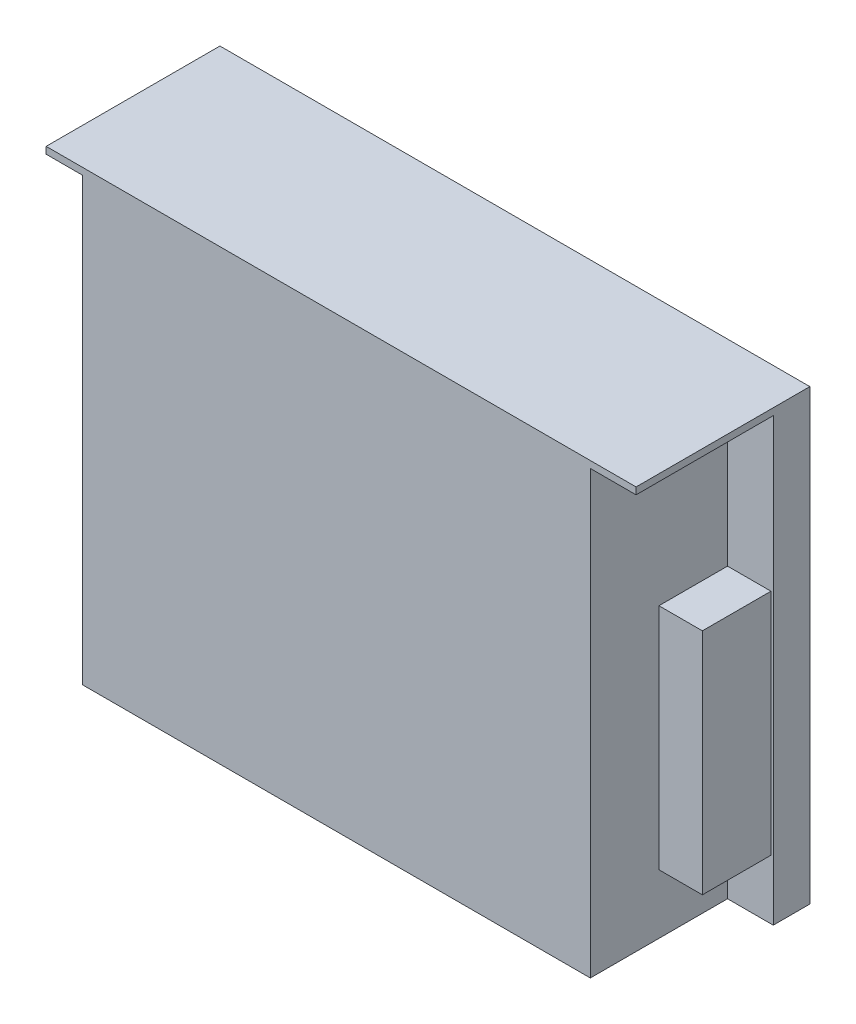
ISO-10303-21;
HEADER;
FILE_DESCRIPTION(('STEP AP214'),'2;1');
FILE_NAME('part.step','',(''),(''),'','','');
FILE_SCHEMA(('AUTOMOTIVE_DESIGN { 1 0 10303 214 1 1 1 1 }'));
ENDSEC;
DATA;
#1=APPLICATION_CONTEXT('core data for automotive mechanical design processes');
#2=APPLICATION_PROTOCOL_DEFINITION('international standard','automotive_design',2000,#1);
#3=PRODUCT_CONTEXT('',#1,'mechanical');
#4=PRODUCT('Part','Part','',(#3));
#5=PRODUCT_RELATED_PRODUCT_CATEGORY('part','',(#4));
#6=PRODUCT_DEFINITION_FORMATION('','',#4);
#7=PRODUCT_DEFINITION_CONTEXT('part definition',#1,'design');
#8=PRODUCT_DEFINITION('design','',#6,#7);
#9=PRODUCT_DEFINITION_SHAPE('','',#8);
#10=(LENGTH_UNIT() NAMED_UNIT(*) SI_UNIT(.MILLI.,.METRE.));
#11=(NAMED_UNIT(*) PLANE_ANGLE_UNIT() SI_UNIT($,.RADIAN.));
#12=(NAMED_UNIT(*) SI_UNIT($,.STERADIAN.) SOLID_ANGLE_UNIT());
#13=UNCERTAINTY_MEASURE_WITH_UNIT(LENGTH_MEASURE(1.E-05),#10,'distance_accuracy_value','');
#14=(GEOMETRIC_REPRESENTATION_CONTEXT(3) GLOBAL_UNCERTAINTY_ASSIGNED_CONTEXT((#13)) GLOBAL_UNIT_ASSIGNED_CONTEXT((#10,
#11,#12)) REPRESENTATION_CONTEXT('',''));
#15=CARTESIAN_POINT('',(0.,0.,0.));
#16=DIRECTION('',(0.,0.,1.));
#17=DIRECTION('',(1.,0.,0.));
#18=AXIS2_PLACEMENT_3D('',#15,#16,#17);
#19=CARTESIAN_POINT('',(8.,0.,17.));
#20=DIRECTION('',(0.707106781186551,0.,-0.707106781186544));
#21=DIRECTION('',(0.,-1.,0.));
#22=AXIS2_PLACEMENT_3D('',#19,#20,#21);
#23=PLANE('',#22);
#24=DIRECTION('',(-0.707106781186546,0.,-0.707106781186549));
#25=VECTOR('',#24,1.);
#26=CARTESIAN_POINT('',(0.,10.,9.));
#27=LINE('',#26,#25);
#28=CARTESIAN_POINT('',(8.,10.,17.));
#29=VERTEX_POINT('',#28);
#30=CARTESIAN_POINT('',(0.,10.,9.));
#31=VERTEX_POINT('',#30);
#32=EDGE_CURVE('E159',#29,#31,#27,.T.);
#33=ORIENTED_EDGE('',*,*,#32,.F.);
#34=DIRECTION('',(0.,-1.,0.));
#35=VECTOR('',#34,1.);
#36=CARTESIAN_POINT('',(8.,0.,17.));
#37=LINE('',#36,#35);
#38=CARTESIAN_POINT('',(8.,96.5,17.));
#39=VERTEX_POINT('',#38);
#40=EDGE_CURVE('E44',#39,#29,#37,.T.);
#41=ORIENTED_EDGE('',*,*,#40,.F.);
#42=DIRECTION('',(0.707106781186544,0.,0.707106781186551));
#43=VECTOR('',#42,1.);
#44=CARTESIAN_POINT('',(8.,96.5,17.));
#45=LINE('',#44,#43);
#46=CARTESIAN_POINT('',(0.,96.5,9.));
#47=VERTEX_POINT('',#46);
#48=EDGE_CURVE('E11',#47,#39,#45,.T.);
#49=ORIENTED_EDGE('',*,*,#48,.F.);
#50=DIRECTION('',(0.,-1.,0.));
#51=VECTOR('',#50,1.);
#52=CARTESIAN_POINT('',(0.,0.,9.));
#53=LINE('',#52,#51);
#54=EDGE_CURVE('E179',#47,#31,#53,.T.);
#55=ORIENTED_EDGE('',*,*,#54,.T.);
#56=EDGE_LOOP('',(#33,#41,#49,#55));
#57=FACE_BOUND('',#56,.T.);
#58=ADVANCED_FACE('F37',(#57),#23,.F.);
#59=CARTESIAN_POINT('',(119.,0.,8.));
#60=DIRECTION('',(-1.,0.,0.));
#61=DIRECTION('',(0.,0.,1.));
#62=AXIS2_PLACEMENT_3D('',#59,#60,#61);
#63=PLANE('',#62);
#64=DIRECTION('',(0.,0.,-1.));
#65=VECTOR('',#64,1.);
#66=CARTESIAN_POINT('',(119.,63.,23.));
#67=LINE('',#66,#65);
#68=CARTESIAN_POINT('',(119.,63.,23.));
#69=VERTEX_POINT('',#68);
#70=CARTESIAN_POINT('',(119.,63.,8.));
#71=VERTEX_POINT('',#70);
#72=EDGE_CURVE('E208',#69,#71,#67,.T.);
#73=ORIENTED_EDGE('',*,*,#72,.T.);
#74=DIRECTION('',(0.,-1.,0.));
#75=VECTOR('',#74,1.);
#76=CARTESIAN_POINT('',(119.,0.,8.));
#77=LINE('',#76,#75);
#78=CARTESIAN_POINT('',(119.,96.5,8.));
#79=VERTEX_POINT('',#78);
#80=EDGE_CURVE('E222',#79,#71,#77,.T.);
#81=ORIENTED_EDGE('',*,*,#80,.F.);
#82=DIRECTION('',(0.,0.,1.));
#83=VECTOR('',#82,1.);
#84=CARTESIAN_POINT('',(119.,96.5,8.));
#85=LINE('',#84,#83);
#86=CARTESIAN_POINT('',(119.,96.5,38.));
#87=VERTEX_POINT('',#86);
#88=EDGE_CURVE('E236',#79,#87,#85,.T.);
#89=ORIENTED_EDGE('',*,*,#88,.T.);
#90=DIRECTION('',(0.,-1.,0.));
#91=VECTOR('',#90,1.);
#92=CARTESIAN_POINT('',(119.,0.,38.));
#93=LINE('',#92,#91);
#94=CARTESIAN_POINT('',(119.,0.,38.));
#95=VERTEX_POINT('',#94);
#96=EDGE_CURVE('E218',#87,#95,#93,.T.);
#97=ORIENTED_EDGE('',*,*,#96,.T.);
#98=DIRECTION('',(0.,0.,1.));
#99=VECTOR('',#98,1.);
#100=CARTESIAN_POINT('',(119.,0.,8.));
#101=LINE('',#100,#99);
#102=CARTESIAN_POINT('',(119.,0.,8.));
#103=VERTEX_POINT('',#102);
#104=EDGE_CURVE('E232',#103,#95,#101,.T.);
#105=ORIENTED_EDGE('',*,*,#104,.F.);
#106=CARTESIAN_POINT('',(119.,13.,8.));
#107=VERTEX_POINT('',#106);
#108=EDGE_CURVE('E221',#107,#103,#77,.T.);
#109=ORIENTED_EDGE('',*,*,#108,.F.);
#110=DIRECTION('',(0.,0.,-1.));
#111=VECTOR('',#110,1.);
#112=CARTESIAN_POINT('',(119.,13.,23.));
#113=LINE('',#112,#111);
#114=CARTESIAN_POINT('',(119.,13.,23.));
#115=VERTEX_POINT('',#114);
#116=EDGE_CURVE('E206',#115,#107,#113,.T.);
#117=ORIENTED_EDGE('',*,*,#116,.F.);
#118=DIRECTION('',(0.,-1.,0.));
#119=VECTOR('',#118,1.);
#120=CARTESIAN_POINT('',(119.,13.,23.));
#121=LINE('',#120,#119);
#122=EDGE_CURVE('E194',#69,#115,#121,.T.);
#123=ORIENTED_EDGE('',*,*,#122,.F.);
#124=EDGE_LOOP('',(#73,#81,#89,#97,#105,#109,#117,#123));
#125=FACE_BOUND('',#124,.T.);
#126=ADVANCED_FACE('F297',(#125),#63,.F.);
#127=CARTESIAN_POINT('',(0.,0.,8.));
#128=DIRECTION('',(0.,0.,1.));
#129=DIRECTION('',(1.,0.,0.));
#130=AXIS2_PLACEMENT_3D('',#127,#128,#129);
#131=PLANE('',#130);
#132=ORIENTED_EDGE('',*,*,#80,.T.);
#133=DIRECTION('',(-1.,0.,0.));
#134=VECTOR('',#133,1.);
#135=CARTESIAN_POINT('',(128.5,63.,8.));
#136=LINE('',#135,#134);
#137=CARTESIAN_POINT('',(128.5,63.,8.));
#138=VERTEX_POINT('',#137);
#139=EDGE_CURVE('E201',#138,#71,#136,.T.);
#140=ORIENTED_EDGE('',*,*,#139,.F.);
#141=DIRECTION('',(0.,1.,0.));
#142=VECTOR('',#141,1.);
#143=CARTESIAN_POINT('',(128.5,13.,8.));
#144=LINE('',#143,#142);
#145=CARTESIAN_POINT('',(128.5,13.,8.));
#146=VERTEX_POINT('',#145);
#147=EDGE_CURVE('E187',#146,#138,#144,.T.);
#148=ORIENTED_EDGE('',*,*,#147,.F.);
#149=DIRECTION('',(1.,0.,0.));
#150=VECTOR('',#149,1.);
#151=CARTESIAN_POINT('',(128.5,13.,8.));
#152=LINE('',#151,#150);
#153=EDGE_CURVE('E192',#107,#146,#152,.T.);
#154=ORIENTED_EDGE('',*,*,#153,.F.);
#155=ORIENTED_EDGE('',*,*,#108,.T.);
#156=DIRECTION('',(1.,0.,0.));
#157=VECTOR('',#156,1.);
#158=CARTESIAN_POINT('',(129.,0.,8.));
#159=LINE('',#158,#157);
#160=CARTESIAN_POINT('',(129.,0.,8.));
#161=VERTEX_POINT('',#160);
#162=EDGE_CURVE('E225',#103,#161,#159,.T.);
#163=ORIENTED_EDGE('',*,*,#162,.T.);
#164=DIRECTION('',(0.,1.,0.));
#165=VECTOR('',#164,1.);
#166=CARTESIAN_POINT('',(129.,0.,8.));
#167=LINE('',#166,#165);
#168=CARTESIAN_POINT('',(129.,96.5,8.));
#169=VERTEX_POINT('',#168);
#170=EDGE_CURVE('E214',#161,#169,#167,.T.);
#171=ORIENTED_EDGE('',*,*,#170,.T.);
#172=DIRECTION('',(-1.,0.,0.));
#173=VECTOR('',#172,1.);
#174=CARTESIAN_POINT('',(129.,96.5,8.));
#175=LINE('',#174,#173);
#176=EDGE_CURVE('E217',#169,#79,#175,.T.);
#177=ORIENTED_EDGE('',*,*,#176,.T.);
#178=EDGE_LOOP('',(#132,#140,#148,#154,#155,#163,#171,#177));
#179=FACE_BOUND('',#178,.T.);
#180=ADVANCED_FACE('F302',(#179),#131,.T.);
#181=CARTESIAN_POINT('',(0.,0.,38.));
#182=DIRECTION('',(1.,0.,0.));
#183=DIRECTION('',(0.,0.,-1.));
#184=AXIS2_PLACEMENT_3D('',#181,#182,#183);
#185=PLANE('',#184);
#186=DIRECTION('',(0.,0.,-1.));
#187=VECTOR('',#186,1.);
#188=CARTESIAN_POINT('',(0.,0.,38.));
#189=LINE('',#188,#187);
#190=CARTESIAN_POINT('',(0.,0.,1.5));
#191=VERTEX_POINT('',#190);
#192=CARTESIAN_POINT('',(0.,0.,0.));
#193=VERTEX_POINT('',#192);
#194=EDGE_CURVE('E168',#191,#193,#189,.T.);
#195=ORIENTED_EDGE('',*,*,#194,.F.);
#196=DIRECTION('',(0.,-1.,0.));
#197=VECTOR('',#196,1.);
#198=CARTESIAN_POINT('',(0.,10.,1.5));
#199=LINE('',#198,#197);
#200=CARTESIAN_POINT('',(0.,10.,1.5));
#201=VERTEX_POINT('',#200);
#202=EDGE_CURVE('E151',#201,#191,#199,.T.);
#203=ORIENTED_EDGE('',*,*,#202,.F.);
#204=DIRECTION('',(0.,0.,-1.));
#205=VECTOR('',#204,1.);
#206=CARTESIAN_POINT('',(0.,10.,1.5));
#207=LINE('',#206,#205);
#208=EDGE_CURVE('E155',#31,#201,#207,.T.);
#209=ORIENTED_EDGE('',*,*,#208,.F.);
#210=ORIENTED_EDGE('',*,*,#54,.F.);
#211=DIRECTION('',(0.,0.,-1.));
#212=VECTOR('',#211,1.);
#213=CARTESIAN_POINT('',(0.,96.5,38.));
#214=LINE('',#213,#212);
#215=CARTESIAN_POINT('',(0.,96.5,38.));
#216=VERTEX_POINT('',#215);
#217=EDGE_CURVE('E170',#216,#47,#214,.T.);
#218=ORIENTED_EDGE('',*,*,#217,.F.);
#219=DIRECTION('',(0.,-1.,0.));
#220=VECTOR('',#219,1.);
#221=CARTESIAN_POINT('',(0.,0.,38.));
#222=LINE('',#221,#220);
#223=CARTESIAN_POINT('',(0.,98.,38.));
#224=VERTEX_POINT('',#223);
#225=EDGE_CURVE('E239',#224,#216,#222,.T.);
#226=ORIENTED_EDGE('',*,*,#225,.F.);
#227=DIRECTION('',(0.,0.,-1.));
#228=VECTOR('',#227,1.);
#229=CARTESIAN_POINT('',(0.,98.,38.));
#230=LINE('',#229,#228);
#231=CARTESIAN_POINT('',(0.,98.,0.));
#232=VERTEX_POINT('',#231);
#233=EDGE_CURVE('E249',#224,#232,#230,.T.);
#234=ORIENTED_EDGE('',*,*,#233,.T.);
#235=DIRECTION('',(0.,-1.,0.));
#236=VECTOR('',#235,1.);
#237=CARTESIAN_POINT('',(0.,0.,0.));
#238=LINE('',#237,#236);
#239=EDGE_CURVE('E235',#232,#193,#238,.T.);
#240=ORIENTED_EDGE('',*,*,#239,.T.);
#241=EDGE_LOOP('',(#195,#203,#209,#210,#218,#226,#234,#240));
#242=FACE_BOUND('',#241,.T.);
#243=ADVANCED_FACE('F166',(#242),#185,.F.);
#244=CARTESIAN_POINT('',(0.,0.,38.));
#245=DIRECTION('',(0.,1.,0.));
#246=DIRECTION('',(0.,0.,1.));
#247=AXIS2_PLACEMENT_3D('',#244,#245,#246);
#248=PLANE('',#247);
#249=DIRECTION('',(0.,0.,1.));
#250=VECTOR('',#249,1.);
#251=CARTESIAN_POINT('',(8.,0.,38.));
#252=LINE('',#251,#250);
#253=CARTESIAN_POINT('',(8.,0.,1.5));
#254=VERTEX_POINT('',#253);
#255=CARTESIAN_POINT('',(8.,0.,38.));
#256=VERTEX_POINT('',#255);
#257=EDGE_CURVE('E181',#254,#256,#252,.T.);
#258=ORIENTED_EDGE('',*,*,#257,.F.);
#259=DIRECTION('',(1.,0.,0.));
#260=VECTOR('',#259,1.);
#261=CARTESIAN_POINT('',(8.,0.,1.5));
#262=LINE('',#261,#260);
#263=EDGE_CURVE('E163',#191,#254,#262,.T.);
#264=ORIENTED_EDGE('',*,*,#263,.F.);
#265=ORIENTED_EDGE('',*,*,#194,.T.);
#266=DIRECTION('',(1.,0.,0.));
#267=VECTOR('',#266,1.);
#268=CARTESIAN_POINT('',(0.,0.,0.));
#269=LINE('',#268,#267);
#270=CARTESIAN_POINT('',(129.,0.,0.));
#271=VERTEX_POINT('',#270);
#272=EDGE_CURVE('E251',#193,#271,#269,.T.);
#273=ORIENTED_EDGE('',*,*,#272,.T.);
#274=DIRECTION('',(0.,0.,-1.));
#275=VECTOR('',#274,1.);
#276=CARTESIAN_POINT('',(129.,0.,38.));
#277=LINE('',#276,#275);
#278=EDGE_CURVE('E262',#161,#271,#277,.T.);
#279=ORIENTED_EDGE('',*,*,#278,.F.);
#280=ORIENTED_EDGE('',*,*,#162,.F.);
#281=ORIENTED_EDGE('',*,*,#104,.T.);
#282=DIRECTION('',(1.,0.,0.));
#283=VECTOR('',#282,1.);
#284=CARTESIAN_POINT('',(0.,0.,38.));
#285=LINE('',#284,#283);
#286=EDGE_CURVE('E242',#256,#95,#285,.T.);
#287=ORIENTED_EDGE('',*,*,#286,.F.);
#288=EDGE_LOOP('',(#258,#264,#265,#273,#279,#280,#281,#287));
#289=FACE_BOUND('',#288,.T.);
#290=ADVANCED_FACE('F290',(#289),#248,.F.);
#291=CARTESIAN_POINT('',(129.,0.,38.));
#292=DIRECTION('',(-1.,0.,0.));
#293=DIRECTION('',(0.,0.,1.));
#294=AXIS2_PLACEMENT_3D('',#291,#292,#293);
#295=PLANE('',#294);
#296=DIRECTION('',(0.,1.,0.));
#297=VECTOR('',#296,1.);
#298=CARTESIAN_POINT('',(129.,0.,38.));
#299=LINE('',#298,#297);
#300=CARTESIAN_POINT('',(129.,96.5,38.));
#301=VERTEX_POINT('',#300);
#302=CARTESIAN_POINT('',(129.,98.,38.));
#303=VERTEX_POINT('',#302);
#304=EDGE_CURVE('E245',#301,#303,#299,.T.);
#305=ORIENTED_EDGE('',*,*,#304,.F.);
#306=DIRECTION('',(0.,0.,1.));
#307=VECTOR('',#306,1.);
#308=CARTESIAN_POINT('',(129.,96.5,8.));
#309=LINE('',#308,#307);
#310=EDGE_CURVE('E227',#169,#301,#309,.T.);
#311=ORIENTED_EDGE('',*,*,#310,.F.);
#312=ORIENTED_EDGE('',*,*,#170,.F.);
#313=ORIENTED_EDGE('',*,*,#278,.T.);
#314=DIRECTION('',(0.,1.,0.));
#315=VECTOR('',#314,1.);
#316=CARTESIAN_POINT('',(129.,0.,0.));
#317=LINE('',#316,#315);
#318=CARTESIAN_POINT('',(129.,98.,0.));
#319=VERTEX_POINT('',#318);
#320=EDGE_CURVE('E254',#271,#319,#317,.T.);
#321=ORIENTED_EDGE('',*,*,#320,.T.);
#322=DIRECTION('',(0.,0.,-1.));
#323=VECTOR('',#322,1.);
#324=CARTESIAN_POINT('',(129.,98.,38.));
#325=LINE('',#324,#323);
#326=EDGE_CURVE('E259',#303,#319,#325,.T.);
#327=ORIENTED_EDGE('',*,*,#326,.F.);
#328=EDGE_LOOP('',(#305,#311,#312,#313,#321,#327));
#329=FACE_BOUND('',#328,.T.);
#330=ADVANCED_FACE('F306',(#329),#295,.F.);
#331=CARTESIAN_POINT('',(0.,98.,38.));
#332=DIRECTION('',(0.,-1.,0.));
#333=DIRECTION('',(0.,0.,-1.));
#334=AXIS2_PLACEMENT_3D('',#331,#332,#333);
#335=PLANE('',#334);
#336=DIRECTION('',(-1.,0.,0.));
#337=VECTOR('',#336,1.);
#338=CARTESIAN_POINT('',(0.,98.,0.));
#339=LINE('',#338,#337);
#340=EDGE_CURVE('E243',#319,#232,#339,.T.);
#341=ORIENTED_EDGE('',*,*,#340,.T.);
#342=ORIENTED_EDGE('',*,*,#233,.F.);
#343=DIRECTION('',(-1.,0.,0.));
#344=VECTOR('',#343,1.);
#345=CARTESIAN_POINT('',(0.,98.,38.));
#346=LINE('',#345,#344);
#347=EDGE_CURVE('E247',#303,#224,#346,.T.);
#348=ORIENTED_EDGE('',*,*,#347,.F.);
#349=ORIENTED_EDGE('',*,*,#326,.T.);
#350=EDGE_LOOP('',(#341,#342,#348,#349));
#351=FACE_BOUND('',#350,.T.);
#352=ADVANCED_FACE('F281',(#351),#335,.F.);
#353=CARTESIAN_POINT('',(0.,0.,38.));
#354=DIRECTION('',(0.,0.,-1.));
#355=DIRECTION('',(-1.,0.,0.));
#356=AXIS2_PLACEMENT_3D('',#353,#354,#355);
#357=PLANE('',#356);
#358=ORIENTED_EDGE('',*,*,#225,.T.);
#359=DIRECTION('',(-1.,0.,0.));
#360=VECTOR('',#359,1.);
#361=CARTESIAN_POINT('',(8.,96.5,38.));
#362=LINE('',#361,#360);
#363=CARTESIAN_POINT('',(8.,96.5,38.));
#364=VERTEX_POINT('',#363);
#365=EDGE_CURVE('E183',#364,#216,#362,.T.);
#366=ORIENTED_EDGE('',*,*,#365,.F.);
#367=DIRECTION('',(0.,1.,0.));
#368=VECTOR('',#367,1.);
#369=CARTESIAN_POINT('',(8.,0.,38.));
#370=LINE('',#369,#368);
#371=EDGE_CURVE('E175',#256,#364,#370,.T.);
#372=ORIENTED_EDGE('',*,*,#371,.F.);
#373=ORIENTED_EDGE('',*,*,#286,.T.);
#374=ORIENTED_EDGE('',*,*,#96,.F.);
#375=DIRECTION('',(-1.,0.,0.));
#376=VECTOR('',#375,1.);
#377=CARTESIAN_POINT('',(129.,96.5,38.));
#378=LINE('',#377,#376);
#379=EDGE_CURVE('E213',#301,#87,#378,.T.);
#380=ORIENTED_EDGE('',*,*,#379,.F.);
#381=ORIENTED_EDGE('',*,*,#304,.T.);
#382=ORIENTED_EDGE('',*,*,#347,.T.);
#383=EDGE_LOOP('',(#358,#366,#372,#373,#374,#380,#381,#382));
#384=FACE_BOUND('',#383,.T.);
#385=ADVANCED_FACE('F273',(#384),#357,.F.);
#386=CARTESIAN_POINT('',(0.,0.,0.));
#387=DIRECTION('',(0.,0.,-1.));
#388=DIRECTION('',(-1.,0.,0.));
#389=AXIS2_PLACEMENT_3D('',#386,#387,#388);
#390=PLANE('',#389);
#391=ORIENTED_EDGE('',*,*,#239,.F.);
#392=ORIENTED_EDGE('',*,*,#340,.F.);
#393=ORIENTED_EDGE('',*,*,#320,.F.);
#394=ORIENTED_EDGE('',*,*,#272,.F.);
#395=EDGE_LOOP('',(#391,#392,#393,#394));
#396=FACE_BOUND('',#395,.T.);
#397=ADVANCED_FACE('F286',(#396),#390,.T.);
#398=CARTESIAN_POINT('',(129.,96.5,8.));
#399=DIRECTION('',(0.,1.,0.));
#400=DIRECTION('',(0.,0.,1.));
#401=AXIS2_PLACEMENT_3D('',#398,#399,#400);
#402=PLANE('',#401);
#403=ORIENTED_EDGE('',*,*,#379,.T.);
#404=ORIENTED_EDGE('',*,*,#88,.F.);
#405=ORIENTED_EDGE('',*,*,#176,.F.);
#406=ORIENTED_EDGE('',*,*,#310,.T.);
#407=EDGE_LOOP('',(#403,#404,#405,#406));
#408=FACE_BOUND('',#407,.T.);
#409=ADVANCED_FACE('F308',(#408),#402,.F.);
#410=CARTESIAN_POINT('',(128.5,13.,23.));
#411=DIRECTION('',(-1.,0.,0.));
#412=DIRECTION('',(0.,0.,1.));
#413=AXIS2_PLACEMENT_3D('',#410,#411,#412);
#414=PLANE('',#413);
#415=ORIENTED_EDGE('',*,*,#147,.T.);
#416=DIRECTION('',(0.,0.,-1.));
#417=VECTOR('',#416,1.);
#418=CARTESIAN_POINT('',(128.5,63.,23.));
#419=LINE('',#418,#417);
#420=CARTESIAN_POINT('',(128.5,63.,23.));
#421=VERTEX_POINT('',#420);
#422=EDGE_CURVE('E211',#421,#138,#419,.T.);
#423=ORIENTED_EDGE('',*,*,#422,.F.);
#424=DIRECTION('',(0.,1.,0.));
#425=VECTOR('',#424,1.);
#426=CARTESIAN_POINT('',(128.5,13.,23.));
#427=LINE('',#426,#425);
#428=CARTESIAN_POINT('',(128.5,13.,23.));
#429=VERTEX_POINT('',#428);
#430=EDGE_CURVE('E188',#429,#421,#427,.T.);
#431=ORIENTED_EDGE('',*,*,#430,.F.);
#432=DIRECTION('',(0.,0.,-1.));
#433=VECTOR('',#432,1.);
#434=CARTESIAN_POINT('',(128.5,13.,23.));
#435=LINE('',#434,#433);
#436=EDGE_CURVE('E198',#429,#146,#435,.T.);
#437=ORIENTED_EDGE('',*,*,#436,.T.);
#438=EDGE_LOOP('',(#415,#423,#431,#437));
#439=FACE_BOUND('',#438,.T.);
#440=ADVANCED_FACE('F319',(#439),#414,.F.);
#441=CARTESIAN_POINT('',(128.5,63.,23.));
#442=DIRECTION('',(0.,-1.,0.));
#443=DIRECTION('',(0.,0.,-1.));
#444=AXIS2_PLACEMENT_3D('',#441,#442,#443);
#445=PLANE('',#444);
#446=ORIENTED_EDGE('',*,*,#139,.T.);
#447=ORIENTED_EDGE('',*,*,#72,.F.);
#448=DIRECTION('',(-1.,0.,0.));
#449=VECTOR('',#448,1.);
#450=CARTESIAN_POINT('',(128.5,63.,23.));
#451=LINE('',#450,#449);
#452=EDGE_CURVE('E191',#421,#69,#451,.T.);
#453=ORIENTED_EDGE('',*,*,#452,.F.);
#454=ORIENTED_EDGE('',*,*,#422,.T.);
#455=EDGE_LOOP('',(#446,#447,#453,#454));
#456=FACE_BOUND('',#455,.T.);
#457=ADVANCED_FACE('F315',(#456),#445,.F.);
#458=CARTESIAN_POINT('',(128.5,13.,23.));
#459=DIRECTION('',(0.,1.,0.));
#460=DIRECTION('',(-1.,0.,0.));
#461=AXIS2_PLACEMENT_3D('',#458,#459,#460);
#462=PLANE('',#461);
#463=ORIENTED_EDGE('',*,*,#153,.T.);
#464=ORIENTED_EDGE('',*,*,#436,.F.);
#465=DIRECTION('',(1.,0.,0.));
#466=VECTOR('',#465,1.);
#467=CARTESIAN_POINT('',(128.5,13.,23.));
#468=LINE('',#467,#466);
#469=EDGE_CURVE('E196',#115,#429,#468,.T.);
#470=ORIENTED_EDGE('',*,*,#469,.F.);
#471=ORIENTED_EDGE('',*,*,#116,.T.);
#472=EDGE_LOOP('',(#463,#464,#470,#471));
#473=FACE_BOUND('',#472,.T.);
#474=ADVANCED_FACE('F323',(#473),#462,.F.);
#475=CARTESIAN_POINT('',(0.,0.,23.));
#476=DIRECTION('',(0.,0.,1.));
#477=DIRECTION('',(1.,0.,0.));
#478=AXIS2_PLACEMENT_3D('',#475,#476,#477);
#479=PLANE('',#478);
#480=ORIENTED_EDGE('',*,*,#430,.T.);
#481=ORIENTED_EDGE('',*,*,#452,.T.);
#482=ORIENTED_EDGE('',*,*,#122,.T.);
#483=ORIENTED_EDGE('',*,*,#469,.T.);
#484=EDGE_LOOP('',(#480,#481,#482,#483));
#485=FACE_BOUND('',#484,.T.);
#486=ADVANCED_FACE('F325',(#485),#479,.T.);
#487=CARTESIAN_POINT('',(8.,96.5,38.));
#488=DIRECTION('',(0.,1.,0.));
#489=DIRECTION('',(0.,0.,1.));
#490=AXIS2_PLACEMENT_3D('',#487,#488,#489);
#491=PLANE('',#490);
#492=ORIENTED_EDGE('',*,*,#217,.T.);
#493=ORIENTED_EDGE('',*,*,#48,.T.);
#494=DIRECTION('',(0.,0.,-1.));
#495=VECTOR('',#494,1.);
#496=CARTESIAN_POINT('',(8.,96.5,38.));
#497=LINE('',#496,#495);
#498=EDGE_CURVE('E178',#364,#39,#497,.T.);
#499=ORIENTED_EDGE('',*,*,#498,.F.);
#500=ORIENTED_EDGE('',*,*,#365,.T.);
#501=EDGE_LOOP('',(#492,#493,#499,#500));
#502=FACE_BOUND('',#501,.T.);
#503=ADVANCED_FACE('F327',(#502),#491,.F.);
#504=CARTESIAN_POINT('',(8.,0.,0.));
#505=DIRECTION('',(-1.,0.,0.));
#506=DIRECTION('',(0.,0.,1.));
#507=AXIS2_PLACEMENT_3D('',#504,#505,#506);
#508=PLANE('',#507);
#509=ORIENTED_EDGE('',*,*,#498,.T.);
#510=ORIENTED_EDGE('',*,*,#40,.T.);
#511=DIRECTION('',(0.,0.,1.));
#512=VECTOR('',#511,1.);
#513=CARTESIAN_POINT('',(8.,10.,17.));
#514=LINE('',#513,#512);
#515=CARTESIAN_POINT('',(8.,10.,1.5));
#516=VERTEX_POINT('',#515);
#517=EDGE_CURVE('E51',#516,#29,#514,.T.);
#518=ORIENTED_EDGE('',*,*,#517,.F.);
#519=DIRECTION('',(0.,-1.,0.));
#520=VECTOR('',#519,1.);
#521=CARTESIAN_POINT('',(8.,10.,1.5));
#522=LINE('',#521,#520);
#523=EDGE_CURVE('E154',#516,#254,#522,.T.);
#524=ORIENTED_EDGE('',*,*,#523,.T.);
#525=ORIENTED_EDGE('',*,*,#257,.T.);
#526=ORIENTED_EDGE('',*,*,#371,.T.);
#527=EDGE_LOOP('',(#509,#510,#518,#524,#525,#526));
#528=FACE_BOUND('',#527,.T.);
#529=ADVANCED_FACE('F267',(#528),#508,.T.);
#530=CARTESIAN_POINT('',(8.,10.,1.5));
#531=DIRECTION('',(0.,0.,-1.));
#532=DIRECTION('',(-1.,0.,0.));
#533=AXIS2_PLACEMENT_3D('',#530,#531,#532);
#534=PLANE('',#533);
#535=ORIENTED_EDGE('',*,*,#263,.T.);
#536=ORIENTED_EDGE('',*,*,#523,.F.);
#537=DIRECTION('',(1.,0.,0.));
#538=VECTOR('',#537,1.);
#539=CARTESIAN_POINT('',(8.,10.,1.5));
#540=LINE('',#539,#538);
#541=EDGE_CURVE('E146',#201,#516,#540,.T.);
#542=ORIENTED_EDGE('',*,*,#541,.F.);
#543=ORIENTED_EDGE('',*,*,#202,.T.);
#544=EDGE_LOOP('',(#535,#536,#542,#543));
#545=FACE_BOUND('',#544,.T.);
#546=ADVANCED_FACE('F149',(#545),#534,.F.);
#547=CARTESIAN_POINT('',(0.,10.,0.));
#548=DIRECTION('',(0.,-1.,0.));
#549=DIRECTION('',(0.,0.,-1.));
#550=AXIS2_PLACEMENT_3D('',#547,#548,#549);
#551=PLANE('',#550);
#552=ORIENTED_EDGE('',*,*,#208,.T.);
#553=ORIENTED_EDGE('',*,*,#541,.T.);
#554=ORIENTED_EDGE('',*,*,#517,.T.);
#555=ORIENTED_EDGE('',*,*,#32,.T.);
#556=EDGE_LOOP('',(#552,#553,#554,#555));
#557=FACE_BOUND('',#556,.T.);
#558=ADVANCED_FACE('F158',(#557),#551,.T.);
#559=CLOSED_SHELL('',(#58,#126,#180,#243,#290,#330,#352,#385,#397,#409,#440,#457,#474,#486,#503,
#529,#546,#558));
#560=MANIFOLD_SOLID_BREP('B2',#559);
#561=ADVANCED_BREP_SHAPE_REPRESENTATION('',(#18,#560),#14);
#562=SHAPE_DEFINITION_REPRESENTATION(#9,#561);
ENDSEC;
END-ISO-10303-21;
